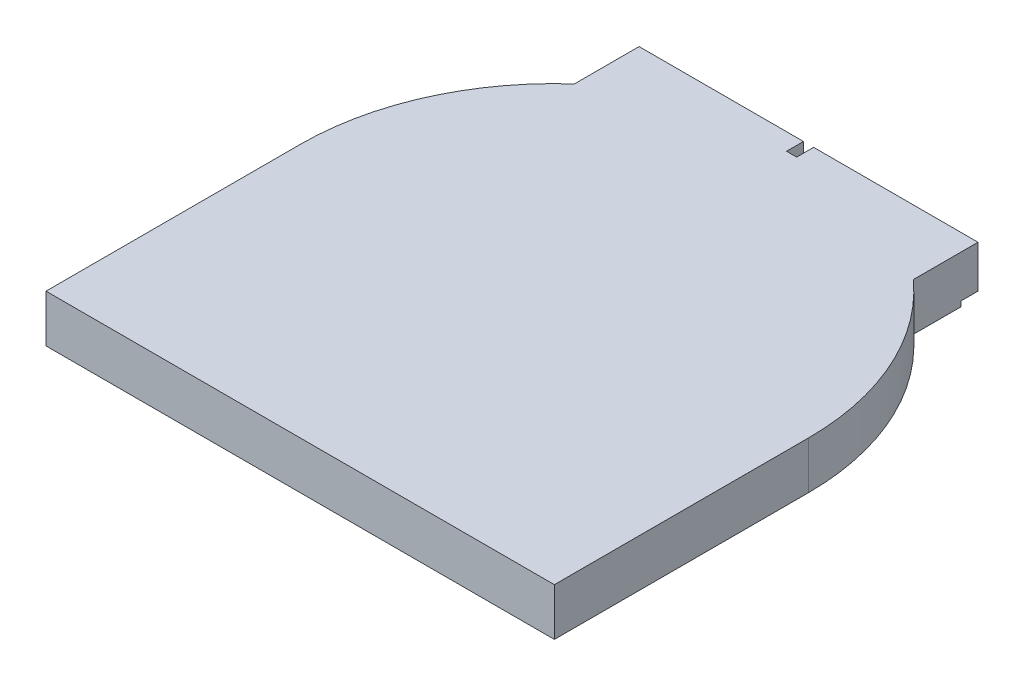
ISO-10303-21;
HEADER;
FILE_DESCRIPTION(('STEP AP214'),'2;1');
FILE_NAME('part.step','',(''),(''),'','','');
FILE_SCHEMA(('AUTOMOTIVE_DESIGN { 1 0 10303 214 1 1 1 1 }'));
ENDSEC;
DATA;
#1=APPLICATION_CONTEXT('core data for automotive mechanical design processes');
#2=APPLICATION_PROTOCOL_DEFINITION('international standard','automotive_design',2000,#1);
#3=PRODUCT_CONTEXT('',#1,'mechanical');
#4=PRODUCT('Part','Part','',(#3));
#5=PRODUCT_RELATED_PRODUCT_CATEGORY('part','',(#4));
#6=PRODUCT_DEFINITION_FORMATION('','',#4);
#7=PRODUCT_DEFINITION_CONTEXT('part definition',#1,'design');
#8=PRODUCT_DEFINITION('design','',#6,#7);
#9=PRODUCT_DEFINITION_SHAPE('','',#8);
#10=(LENGTH_UNIT() NAMED_UNIT(*) SI_UNIT(.MILLI.,.METRE.));
#11=(NAMED_UNIT(*) PLANE_ANGLE_UNIT() SI_UNIT($,.RADIAN.));
#12=(NAMED_UNIT(*) SI_UNIT($,.STERADIAN.) SOLID_ANGLE_UNIT());
#13=UNCERTAINTY_MEASURE_WITH_UNIT(LENGTH_MEASURE(1.E-05),#10,'distance_accuracy_value','');
#14=(GEOMETRIC_REPRESENTATION_CONTEXT(3) GLOBAL_UNCERTAINTY_ASSIGNED_CONTEXT((#13)) GLOBAL_UNIT_ASSIGNED_CONTEXT((#10,
#11,#12)) REPRESENTATION_CONTEXT('',''));
#15=CARTESIAN_POINT('',(0.,0.,0.));
#16=DIRECTION('',(0.,0.,1.));
#17=DIRECTION('',(1.,0.,0.));
#18=AXIS2_PLACEMENT_3D('',#15,#16,#17);
#19=CARTESIAN_POINT('',(-4.,0.8,-5.1234753829798));
#20=DIRECTION('',(0.,-1.,0.));
#21=DIRECTION('',(0.,0.,-1.));
#22=AXIS2_PLACEMENT_3D('',#19,#20,#21);
#23=CYLINDRICAL_SURFACE('',#22,1.);
#24=CARTESIAN_POINT('',(-4.,0.4,-5.1234753829798));
#25=DIRECTION('',(0.,-1.,0.));
#26=DIRECTION('',(0.,0.,-1.));
#27=AXIS2_PLACEMENT_3D('',#24,#25,#26);
#28=CIRCLE('',#27,1.);
#29=CARTESIAN_POINT('',(-3.,0.4,-5.1234753829798));
#30=VERTEX_POINT('',#29);
#31=CARTESIAN_POINT('',(-3.38461538461538,0.4,-4.33524840098291));
#32=VERTEX_POINT('',#31);
#33=EDGE_CURVE('E202',#30,#32,#28,.T.);
#34=ORIENTED_EDGE('',*,*,#33,.F.);
#35=DIRECTION('',(0.,-1.,0.));
#36=VECTOR('',#35,1.);
#37=CARTESIAN_POINT('',(-3.,0.8,-5.1234753829798));
#38=LINE('',#37,#36);
#39=CARTESIAN_POINT('',(-3.,0.8,-5.1234753829798));
#40=VERTEX_POINT('',#39);
#41=EDGE_CURVE('E200',#40,#30,#38,.T.);
#42=ORIENTED_EDGE('',*,*,#41,.F.);
#43=CARTESIAN_POINT('',(-4.,0.8,-5.1234753829798));
#44=DIRECTION('',(0.,1.,0.));
#45=DIRECTION('',(0.,0.,1.));
#46=AXIS2_PLACEMENT_3D('',#43,#44,#45);
#47=CIRCLE('',#46,1.);
#48=CARTESIAN_POINT('',(-3.38461538461538,0.8,-4.33524840098291));
#49=VERTEX_POINT('',#48);
#50=EDGE_CURVE('E262',#49,#40,#47,.T.);
#51=ORIENTED_EDGE('',*,*,#50,.F.);
#52=DIRECTION('',(0.,-1.,0.));
#53=VECTOR('',#52,1.);
#54=CARTESIAN_POINT('',(-3.38461538461538,0.8,-4.33524840098291));
#55=LINE('',#54,#53);
#56=EDGE_CURVE('E285',#49,#32,#55,.T.);
#57=ORIENTED_EDGE('',*,*,#56,.T.);
#58=EDGE_LOOP('',(#34,#42,#51,#57));
#59=FACE_BOUND('',#58,.T.);
#60=ADVANCED_FACE('F40',(#59),#23,.T.);
#61=CARTESIAN_POINT('',(-3.,0.8,-5.5));
#62=DIRECTION('',(-1.,0.,0.));
#63=DIRECTION('',(0.,0.,1.));
#64=AXIS2_PLACEMENT_3D('',#61,#62,#63);
#65=PLANE('',#64);
#66=DIRECTION('',(0.,0.,1.));
#67=VECTOR('',#66,1.);
#68=CARTESIAN_POINT('',(-3.,0.4,-5.5));
#69=LINE('',#68,#67);
#70=CARTESIAN_POINT('',(-3.,0.4,-7.));
#71=VERTEX_POINT('',#70);
#72=EDGE_CURVE('E188',#71,#30,#69,.T.);
#73=ORIENTED_EDGE('',*,*,#72,.F.);
#74=DIRECTION('',(0.,-1.,0.));
#75=VECTOR('',#74,1.);
#76=CARTESIAN_POINT('',(-3.,0.8,-7.));
#77=LINE('',#76,#75);
#78=CARTESIAN_POINT('',(-3.,0.55,-7.));
#79=VERTEX_POINT('',#78);
#80=EDGE_CURVE('E198',#79,#71,#77,.T.);
#81=ORIENTED_EDGE('',*,*,#80,.F.);
#82=DIRECTION('',(0.,0.,-1.));
#83=VECTOR('',#82,1.);
#84=CARTESIAN_POINT('',(-3.,0.55,-5.5));
#85=LINE('',#84,#83);
#86=CARTESIAN_POINT('',(-3.,0.55,-7.5));
#87=VERTEX_POINT('',#86);
#88=EDGE_CURVE('E224',#79,#87,#85,.T.);
#89=ORIENTED_EDGE('',*,*,#88,.T.);
#90=DIRECTION('',(0.,-1.,0.));
#91=VECTOR('',#90,1.);
#92=CARTESIAN_POINT('',(-3.,0.8,-7.5));
#93=LINE('',#92,#91);
#94=CARTESIAN_POINT('',(-3.,0.8,-7.5));
#95=VERTEX_POINT('',#94);
#96=EDGE_CURVE('E333',#95,#87,#93,.T.);
#97=ORIENTED_EDGE('',*,*,#96,.F.);
#98=DIRECTION('',(0.,0.,-1.));
#99=VECTOR('',#98,1.);
#100=CARTESIAN_POINT('',(-3.,0.8,-5.5));
#101=LINE('',#100,#99);
#102=EDGE_CURVE('E269',#40,#95,#101,.T.);
#103=ORIENTED_EDGE('',*,*,#102,.F.);
#104=ORIENTED_EDGE('',*,*,#41,.T.);
#105=EDGE_LOOP('',(#73,#81,#89,#97,#103,#104));
#106=FACE_BOUND('',#105,.T.);
#107=ADVANCED_FACE('F196',(#106),#65,.F.);
#108=CARTESIAN_POINT('',(-5.,0.8,-7.5));
#109=DIRECTION('',(1.,0.,0.));
#110=DIRECTION('',(0.,0.,-1.));
#111=AXIS2_PLACEMENT_3D('',#108,#109,#110);
#112=PLANE('',#111);
#113=DIRECTION('',(0.,0.,-1.));
#114=VECTOR('',#113,1.);
#115=CARTESIAN_POINT('',(-5.,0.4,-7.5));
#116=LINE('',#115,#114);
#117=CARTESIAN_POINT('',(-5.,0.4,-5.59016994374947));
#118=VERTEX_POINT('',#117);
#119=CARTESIAN_POINT('',(-5.,0.4,-7.));
#120=VERTEX_POINT('',#119);
#121=EDGE_CURVE('E55',#118,#120,#116,.T.);
#122=ORIENTED_EDGE('',*,*,#121,.F.);
#123=DIRECTION('',(0.,-1.,0.));
#124=VECTOR('',#123,1.);
#125=CARTESIAN_POINT('',(-5.,0.8,-5.59016994374947));
#126=LINE('',#125,#124);
#127=CARTESIAN_POINT('',(-5.,1.8,-5.59016994374947));
#128=VERTEX_POINT('',#127);
#129=EDGE_CURVE('E325',#128,#118,#126,.T.);
#130=ORIENTED_EDGE('',*,*,#129,.F.);
#131=DIRECTION('',(0.,0.,1.));
#132=VECTOR('',#131,1.);
#133=CARTESIAN_POINT('',(-5.,1.8,-7.5));
#134=LINE('',#133,#132);
#135=CARTESIAN_POINT('',(-5.,1.8,-7.5));
#136=VERTEX_POINT('',#135);
#137=EDGE_CURVE('E242',#136,#128,#134,.T.);
#138=ORIENTED_EDGE('',*,*,#137,.F.);
#139=DIRECTION('',(0.,-1.,0.));
#140=VECTOR('',#139,1.);
#141=CARTESIAN_POINT('',(-5.,0.8,-7.5));
#142=LINE('',#141,#140);
#143=CARTESIAN_POINT('',(-5.,0.55,-7.5));
#144=VERTEX_POINT('',#143);
#145=EDGE_CURVE('E329',#136,#144,#142,.T.);
#146=ORIENTED_EDGE('',*,*,#145,.T.);
#147=DIRECTION('',(0.,0.,-1.));
#148=VECTOR('',#147,1.);
#149=CARTESIAN_POINT('',(-5.,0.55,-7.));
#150=LINE('',#149,#148);
#151=CARTESIAN_POINT('',(-5.,0.55,-7.));
#152=VERTEX_POINT('',#151);
#153=EDGE_CURVE('E376',#152,#144,#150,.T.);
#154=ORIENTED_EDGE('',*,*,#153,.F.);
#155=DIRECTION('',(0.,1.,0.));
#156=VECTOR('',#155,1.);
#157=CARTESIAN_POINT('',(-5.,0.55,-7.));
#158=LINE('',#157,#156);
#159=EDGE_CURVE('E490',#120,#152,#158,.T.);
#160=ORIENTED_EDGE('',*,*,#159,.F.);
#161=EDGE_LOOP('',(#122,#130,#138,#146,#154,#160));
#162=FACE_BOUND('',#161,.T.);
#163=ADVANCED_FACE('F412',(#162),#112,.F.);
#164=CARTESIAN_POINT('',(0.,0.8,0.));
#165=DIRECTION('',(0.,-1.,0.));
#166=DIRECTION('',(0.,0.,-1.));
#167=AXIS2_PLACEMENT_3D('',#164,#165,#166);
#168=CYLINDRICAL_SURFACE('',#167,7.5);
#169=CARTESIAN_POINT('',(0.,0.4,0.));
#170=DIRECTION('',(0.,-1.,0.));
#171=DIRECTION('',(0.,0.,-1.));
#172=AXIS2_PLACEMENT_3D('',#169,#170,#171);
#173=CIRCLE('',#172,7.5);
#174=CARTESIAN_POINT('',(-7.5,0.4,0.));
#175=VERTEX_POINT('',#174);
#176=EDGE_CURVE('E416',#175,#118,#173,.T.);
#177=ORIENTED_EDGE('',*,*,#176,.F.);
#178=DIRECTION('',(0.,-1.,0.));
#179=VECTOR('',#178,1.);
#180=CARTESIAN_POINT('',(-7.5,0.8,0.));
#181=LINE('',#180,#179);
#182=CARTESIAN_POINT('',(-7.5,1.8,0.));
#183=VERTEX_POINT('',#182);
#184=EDGE_CURVE('E321',#183,#175,#181,.T.);
#185=ORIENTED_EDGE('',*,*,#184,.F.);
#186=CARTESIAN_POINT('',(0.,1.8,0.));
#187=DIRECTION('',(0.,1.,0.));
#188=DIRECTION('',(0.,0.,1.));
#189=AXIS2_PLACEMENT_3D('',#186,#187,#188);
#190=CIRCLE('',#189,7.5);
#191=EDGE_CURVE('E246',#128,#183,#190,.T.);
#192=ORIENTED_EDGE('',*,*,#191,.F.);
#193=ORIENTED_EDGE('',*,*,#129,.T.);
#194=EDGE_LOOP('',(#177,#185,#192,#193));
#195=FACE_BOUND('',#194,.T.);
#196=ADVANCED_FACE('F415',(#195),#168,.T.);
#197=CARTESIAN_POINT('',(-7.5,0.8,0.));
#198=DIRECTION('',(1.,0.,0.));
#199=DIRECTION('',(0.,0.,-1.));
#200=AXIS2_PLACEMENT_3D('',#197,#198,#199);
#201=PLANE('',#200);
#202=DIRECTION('',(0.,0.,-1.));
#203=VECTOR('',#202,1.);
#204=CARTESIAN_POINT('',(-7.5,0.4,0.));
#205=LINE('',#204,#203);
#206=CARTESIAN_POINT('',(-7.5,0.4,7.5));
#207=VERTEX_POINT('',#206);
#208=EDGE_CURVE('E364',#207,#175,#205,.T.);
#209=ORIENTED_EDGE('',*,*,#208,.F.);
#210=DIRECTION('',(0.,-1.,0.));
#211=VECTOR('',#210,1.);
#212=CARTESIAN_POINT('',(-7.5,0.8,7.5));
#213=LINE('',#212,#211);
#214=CARTESIAN_POINT('',(-7.5,1.8,7.5));
#215=VERTEX_POINT('',#214);
#216=EDGE_CURVE('E317',#215,#207,#213,.T.);
#217=ORIENTED_EDGE('',*,*,#216,.F.);
#218=DIRECTION('',(0.,0.,1.));
#219=VECTOR('',#218,1.);
#220=CARTESIAN_POINT('',(-7.5,1.8,0.));
#221=LINE('',#220,#219);
#222=EDGE_CURVE('E250',#183,#215,#221,.T.);
#223=ORIENTED_EDGE('',*,*,#222,.F.);
#224=ORIENTED_EDGE('',*,*,#184,.T.);
#225=EDGE_LOOP('',(#209,#217,#223,#224));
#226=FACE_BOUND('',#225,.T.);
#227=ADVANCED_FACE('F421',(#226),#201,.F.);
#228=CARTESIAN_POINT('',(-7.5,0.8,7.5));
#229=DIRECTION('',(0.,0.,-1.));
#230=DIRECTION('',(-1.,0.,0.));
#231=AXIS2_PLACEMENT_3D('',#228,#229,#230);
#232=PLANE('',#231);
#233=DIRECTION('',(-1.,0.,0.));
#234=VECTOR('',#233,1.);
#235=CARTESIAN_POINT('',(-7.5,0.4,7.5));
#236=LINE('',#235,#234);
#237=CARTESIAN_POINT('',(7.5,0.4,7.5));
#238=VERTEX_POINT('',#237);
#239=EDGE_CURVE('E425',#238,#207,#236,.T.);
#240=ORIENTED_EDGE('',*,*,#239,.F.);
#241=DIRECTION('',(0.,-1.,0.));
#242=VECTOR('',#241,1.);
#243=CARTESIAN_POINT('',(7.5,0.8,7.5));
#244=LINE('',#243,#242);
#245=CARTESIAN_POINT('',(7.5,1.8,7.5));
#246=VERTEX_POINT('',#245);
#247=EDGE_CURVE('E313',#246,#238,#244,.T.);
#248=ORIENTED_EDGE('',*,*,#247,.F.);
#249=DIRECTION('',(1.,0.,0.));
#250=VECTOR('',#249,1.);
#251=CARTESIAN_POINT('',(-7.5,1.8,7.5));
#252=LINE('',#251,#250);
#253=EDGE_CURVE('E254',#215,#246,#252,.T.);
#254=ORIENTED_EDGE('',*,*,#253,.F.);
#255=ORIENTED_EDGE('',*,*,#216,.T.);
#256=EDGE_LOOP('',(#240,#248,#254,#255));
#257=FACE_BOUND('',#256,.T.);
#258=ADVANCED_FACE('F424',(#257),#232,.F.);
#259=CARTESIAN_POINT('',(7.5,0.8,7.5));
#260=DIRECTION('',(-1.,0.,0.));
#261=DIRECTION('',(0.,0.,1.));
#262=AXIS2_PLACEMENT_3D('',#259,#260,#261);
#263=PLANE('',#262);
#264=DIRECTION('',(0.,0.,1.));
#265=VECTOR('',#264,1.);
#266=CARTESIAN_POINT('',(7.5,0.4,7.5));
#267=LINE('',#266,#265);
#268=CARTESIAN_POINT('',(7.5,0.4,0.));
#269=VERTEX_POINT('',#268);
#270=EDGE_CURVE('E431',#269,#238,#267,.T.);
#271=ORIENTED_EDGE('',*,*,#270,.F.);
#272=DIRECTION('',(0.,-1.,0.));
#273=VECTOR('',#272,1.);
#274=CARTESIAN_POINT('',(7.5,0.8,0.));
#275=LINE('',#274,#273);
#276=CARTESIAN_POINT('',(7.5,1.8,0.));
#277=VERTEX_POINT('',#276);
#278=EDGE_CURVE('E309',#277,#269,#275,.T.);
#279=ORIENTED_EDGE('',*,*,#278,.F.);
#280=DIRECTION('',(0.,0.,-1.));
#281=VECTOR('',#280,1.);
#282=CARTESIAN_POINT('',(7.5,1.8,7.5));
#283=LINE('',#282,#281);
#284=EDGE_CURVE('E258',#246,#277,#283,.T.);
#285=ORIENTED_EDGE('',*,*,#284,.F.);
#286=ORIENTED_EDGE('',*,*,#247,.T.);
#287=EDGE_LOOP('',(#271,#279,#285,#286));
#288=FACE_BOUND('',#287,.T.);
#289=ADVANCED_FACE('F430',(#288),#263,.F.);
#290=CARTESIAN_POINT('',(0.,0.8,0.));
#291=DIRECTION('',(0.,-1.,0.));
#292=DIRECTION('',(0.,0.,-1.));
#293=AXIS2_PLACEMENT_3D('',#290,#291,#292);
#294=CYLINDRICAL_SURFACE('',#293,7.5);
#295=CARTESIAN_POINT('',(0.,0.4,0.));
#296=DIRECTION('',(0.,-1.,0.));
#297=DIRECTION('',(0.,0.,-1.));
#298=AXIS2_PLACEMENT_3D('',#295,#296,#297);
#299=CIRCLE('',#298,7.5);
#300=CARTESIAN_POINT('',(5.,0.4,-5.59016994374947));
#301=VERTEX_POINT('',#300);
#302=EDGE_CURVE('E435',#301,#269,#299,.T.);
#303=ORIENTED_EDGE('',*,*,#302,.F.);
#304=DIRECTION('',(0.,-1.,0.));
#305=VECTOR('',#304,1.);
#306=CARTESIAN_POINT('',(5.,0.8,-5.59016994374947));
#307=LINE('',#306,#305);
#308=CARTESIAN_POINT('',(5.,1.8,-5.59016994374947));
#309=VERTEX_POINT('',#308);
#310=EDGE_CURVE('E305',#309,#301,#307,.T.);
#311=ORIENTED_EDGE('',*,*,#310,.F.);
#312=CARTESIAN_POINT('',(0.,1.8,0.));
#313=DIRECTION('',(0.,1.,0.));
#314=DIRECTION('',(0.,0.,1.));
#315=AXIS2_PLACEMENT_3D('',#312,#313,#314);
#316=CIRCLE('',#315,7.5);
#317=EDGE_CURVE('E228',#277,#309,#316,.T.);
#318=ORIENTED_EDGE('',*,*,#317,.F.);
#319=ORIENTED_EDGE('',*,*,#278,.T.);
#320=EDGE_LOOP('',(#303,#311,#318,#319));
#321=FACE_BOUND('',#320,.T.);
#322=ADVANCED_FACE('F434',(#321),#294,.T.);
#323=CARTESIAN_POINT('',(5.,0.8,-7.5));
#324=DIRECTION('',(-1.,0.,0.));
#325=DIRECTION('',(0.,0.,1.));
#326=AXIS2_PLACEMENT_3D('',#323,#324,#325);
#327=PLANE('',#326);
#328=DIRECTION('',(0.,0.,1.));
#329=VECTOR('',#328,1.);
#330=CARTESIAN_POINT('',(5.,0.4,-7.5));
#331=LINE('',#330,#329);
#332=CARTESIAN_POINT('',(5.,0.4,-7.));
#333=VERTEX_POINT('',#332);
#334=EDGE_CURVE('E471',#333,#301,#331,.T.);
#335=ORIENTED_EDGE('',*,*,#334,.F.);
#336=DIRECTION('',(0.,-1.,0.));
#337=VECTOR('',#336,1.);
#338=CARTESIAN_POINT('',(5.,0.55,-7.));
#339=LINE('',#338,#337);
#340=CARTESIAN_POINT('',(5.,0.55,-7.));
#341=VERTEX_POINT('',#340);
#342=EDGE_CURVE('E486',#341,#333,#339,.T.);
#343=ORIENTED_EDGE('',*,*,#342,.F.);
#344=DIRECTION('',(0.,0.,-1.));
#345=VECTOR('',#344,1.);
#346=CARTESIAN_POINT('',(5.,0.55,-7.));
#347=LINE('',#346,#345);
#348=CARTESIAN_POINT('',(5.,0.55,-7.5));
#349=VERTEX_POINT('',#348);
#350=EDGE_CURVE('E379',#341,#349,#347,.T.);
#351=ORIENTED_EDGE('',*,*,#350,.T.);
#352=DIRECTION('',(0.,-1.,0.));
#353=VECTOR('',#352,1.);
#354=CARTESIAN_POINT('',(5.,0.8,-7.5));
#355=LINE('',#354,#353);
#356=CARTESIAN_POINT('',(5.,1.8,-7.5));
#357=VERTEX_POINT('',#356);
#358=EDGE_CURVE('E301',#357,#349,#355,.T.);
#359=ORIENTED_EDGE('',*,*,#358,.F.);
#360=DIRECTION('',(0.,0.,-1.));
#361=VECTOR('',#360,1.);
#362=CARTESIAN_POINT('',(5.,1.8,-5.59016994374947));
#363=LINE('',#362,#361);
#364=EDGE_CURVE('E232',#309,#357,#363,.T.);
#365=ORIENTED_EDGE('',*,*,#364,.F.);
#366=ORIENTED_EDGE('',*,*,#310,.T.);
#367=EDGE_LOOP('',(#335,#343,#351,#359,#365,#366));
#368=FACE_BOUND('',#367,.T.);
#369=ADVANCED_FACE('F525',(#368),#327,.F.);
#370=CARTESIAN_POINT('',(3.,0.8,-5.5));
#371=DIRECTION('',(1.,0.,0.));
#372=DIRECTION('',(0.,0.,-1.));
#373=AXIS2_PLACEMENT_3D('',#370,#371,#372);
#374=PLANE('',#373);
#375=DIRECTION('',(0.,0.,-1.));
#376=VECTOR('',#375,1.);
#377=CARTESIAN_POINT('',(3.,0.4,-5.5));
#378=LINE('',#377,#376);
#379=CARTESIAN_POINT('',(3.,0.4,-5.1234753829798));
#380=VERTEX_POINT('',#379);
#381=CARTESIAN_POINT('',(3.,0.4,-7.));
#382=VERTEX_POINT('',#381);
#383=EDGE_CURVE('E443',#380,#382,#378,.T.);
#384=ORIENTED_EDGE('',*,*,#383,.F.);
#385=DIRECTION('',(0.,-1.,0.));
#386=VECTOR('',#385,1.);
#387=CARTESIAN_POINT('',(3.,0.8,-5.1234753829798));
#388=LINE('',#387,#386);
#389=CARTESIAN_POINT('',(3.,0.8,-5.1234753829798));
#390=VERTEX_POINT('',#389);
#391=EDGE_CURVE('E293',#390,#380,#388,.T.);
#392=ORIENTED_EDGE('',*,*,#391,.F.);
#393=DIRECTION('',(0.,0.,1.));
#394=VECTOR('',#393,1.);
#395=CARTESIAN_POINT('',(3.,0.8,-5.5));
#396=LINE('',#395,#394);
#397=CARTESIAN_POINT('',(3.,0.8,-7.5));
#398=VERTEX_POINT('',#397);
#399=EDGE_CURVE('E273',#398,#390,#396,.T.);
#400=ORIENTED_EDGE('',*,*,#399,.F.);
#401=DIRECTION('',(0.,-1.,0.));
#402=VECTOR('',#401,1.);
#403=CARTESIAN_POINT('',(3.,0.8,-7.5));
#404=LINE('',#403,#402);
#405=CARTESIAN_POINT('',(3.,0.55,-7.5));
#406=VERTEX_POINT('',#405);
#407=EDGE_CURVE('E297',#398,#406,#404,.T.);
#408=ORIENTED_EDGE('',*,*,#407,.T.);
#409=DIRECTION('',(0.,0.,1.));
#410=VECTOR('',#409,1.);
#411=CARTESIAN_POINT('',(3.,0.55,-5.5));
#412=LINE('',#411,#410);
#413=CARTESIAN_POINT('',(3.,0.55,-7.));
#414=VERTEX_POINT('',#413);
#415=EDGE_CURVE('E48',#406,#414,#412,.T.);
#416=ORIENTED_EDGE('',*,*,#415,.T.);
#417=DIRECTION('',(0.,1.,0.));
#418=VECTOR('',#417,1.);
#419=CARTESIAN_POINT('',(3.,0.8,-7.));
#420=LINE('',#419,#418);
#421=EDGE_CURVE('E210',#382,#414,#420,.T.);
#422=ORIENTED_EDGE('',*,*,#421,.F.);
#423=EDGE_LOOP('',(#384,#392,#400,#408,#416,#422));
#424=FACE_BOUND('',#423,.T.);
#425=ADVANCED_FACE('F343',(#424),#374,.F.);
#426=CARTESIAN_POINT('',(4.,0.8,-5.1234753829798));
#427=DIRECTION('',(0.,-1.,0.));
#428=DIRECTION('',(0.,0.,-1.));
#429=AXIS2_PLACEMENT_3D('',#426,#427,#428);
#430=CYLINDRICAL_SURFACE('',#429,1.);
#431=CARTESIAN_POINT('',(4.,0.4,-5.1234753829798));
#432=DIRECTION('',(0.,-1.,0.));
#433=DIRECTION('',(0.,0.,-1.));
#434=AXIS2_PLACEMENT_3D('',#431,#432,#433);
#435=CIRCLE('',#434,1.);
#436=CARTESIAN_POINT('',(3.38461538461539,0.4,-4.33524840098291));
#437=VERTEX_POINT('',#436);
#438=EDGE_CURVE('E448',#437,#380,#435,.T.);
#439=ORIENTED_EDGE('',*,*,#438,.F.);
#440=DIRECTION('',(0.,-1.,0.));
#441=VECTOR('',#440,1.);
#442=CARTESIAN_POINT('',(3.38461538461539,0.8,-4.33524840098291));
#443=LINE('',#442,#441);
#444=CARTESIAN_POINT('',(3.38461538461539,0.8,-4.33524840098291));
#445=VERTEX_POINT('',#444);
#446=EDGE_CURVE('E289',#445,#437,#443,.T.);
#447=ORIENTED_EDGE('',*,*,#446,.F.);
#448=CARTESIAN_POINT('',(4.,0.8,-5.1234753829798));
#449=DIRECTION('',(0.,1.,0.));
#450=DIRECTION('',(0.,0.,-1.));
#451=AXIS2_PLACEMENT_3D('',#448,#449,#450);
#452=CIRCLE('',#451,1.);
#453=EDGE_CURVE('E277',#390,#445,#452,.T.);
#454=ORIENTED_EDGE('',*,*,#453,.F.);
#455=ORIENTED_EDGE('',*,*,#391,.T.);
#456=EDGE_LOOP('',(#439,#447,#454,#455));
#457=FACE_BOUND('',#456,.T.);
#458=ADVANCED_FACE('F446',(#457),#430,.T.);
#459=CARTESIAN_POINT('',(0.,0.8,0.));
#460=DIRECTION('',(0.,-1.,0.));
#461=DIRECTION('',(0.,0.,-1.));
#462=AXIS2_PLACEMENT_3D('',#459,#460,#461);
#463=CYLINDRICAL_SURFACE('',#462,5.5);
#464=CARTESIAN_POINT('',(0.,0.4,0.));
#465=DIRECTION('',(0.,-1.,0.));
#466=DIRECTION('',(0.,0.,-1.));
#467=AXIS2_PLACEMENT_3D('',#464,#465,#466);
#468=CIRCLE('',#467,5.5);
#469=EDGE_CURVE('E455',#32,#437,#468,.F.);
#470=ORIENTED_EDGE('',*,*,#469,.F.);
#471=ORIENTED_EDGE('',*,*,#56,.F.);
#472=CARTESIAN_POINT('',(0.,0.8,0.));
#473=DIRECTION('',(0.,-1.,0.));
#474=DIRECTION('',(0.,0.,1.));
#475=AXIS2_PLACEMENT_3D('',#472,#473,#474);
#476=CIRCLE('',#475,5.5);
#477=EDGE_CURVE('E281',#445,#49,#476,.T.);
#478=ORIENTED_EDGE('',*,*,#477,.F.);
#479=ORIENTED_EDGE('',*,*,#446,.T.);
#480=EDGE_LOOP('',(#470,#471,#478,#479));
#481=FACE_BOUND('',#480,.T.);
#482=ADVANCED_FACE('F452',(#481),#463,.F.);
#483=CARTESIAN_POINT('',(0.,0.,-7.));
#484=DIRECTION('',(0.,0.,-1.));
#485=DIRECTION('',(-1.,0.,0.));
#486=AXIS2_PLACEMENT_3D('',#483,#484,#485);
#487=PLANE('',#486);
#488=ORIENTED_EDGE('',*,*,#342,.T.);
#489=DIRECTION('',(-1.,0.,0.));
#490=VECTOR('',#489,1.);
#491=CARTESIAN_POINT('',(0.,0.4,-7.));
#492=LINE('',#491,#490);
#493=EDGE_CURVE('E467',#333,#382,#492,.T.);
#494=ORIENTED_EDGE('',*,*,#493,.T.);
#495=ORIENTED_EDGE('',*,*,#421,.T.);
#496=DIRECTION('',(1.,0.,0.));
#497=VECTOR('',#496,1.);
#498=CARTESIAN_POINT('',(5.,0.55,-7.));
#499=LINE('',#498,#497);
#500=EDGE_CURVE('E352',#414,#341,#499,.T.);
#501=ORIENTED_EDGE('',*,*,#500,.T.);
#502=EDGE_LOOP('',(#488,#494,#495,#501));
#503=FACE_BOUND('',#502,.T.);
#504=ADVANCED_FACE('F536',(#503),#487,.T.);
#505=ORIENTED_EDGE('',*,*,#80,.T.);
#506=DIRECTION('',(-1.,0.,0.));
#507=VECTOR('',#506,1.);
#508=CARTESIAN_POINT('',(0.,0.4,-7.));
#509=LINE('',#508,#507);
#510=EDGE_CURVE('E11',#71,#120,#509,.T.);
#511=ORIENTED_EDGE('',*,*,#510,.T.);
#512=ORIENTED_EDGE('',*,*,#159,.T.);
#513=DIRECTION('',(1.,0.,0.));
#514=VECTOR('',#513,1.);
#515=CARTESIAN_POINT('',(-0.15,0.55,-7.));
#516=LINE('',#515,#514);
#517=EDGE_CURVE('E207',#152,#79,#516,.T.);
#518=ORIENTED_EDGE('',*,*,#517,.T.);
#519=EDGE_LOOP('',(#505,#511,#512,#518));
#520=FACE_BOUND('',#519,.T.);
#521=ADVANCED_FACE('F205',(#520),#487,.T.);
#522=CARTESIAN_POINT('',(3.,0.8,-7.5));
#523=DIRECTION('',(0.,0.,1.));
#524=DIRECTION('',(1.,0.,0.));
#525=AXIS2_PLACEMENT_3D('',#522,#523,#524);
#526=PLANE('',#525);
#527=DIRECTION('',(-1.,0.,0.));
#528=VECTOR('',#527,1.);
#529=CARTESIAN_POINT('',(-3.,0.8,-7.5));
#530=LINE('',#529,#528);
#531=CARTESIAN_POINT('',(0.15,0.8,-7.5));
#532=VERTEX_POINT('',#531);
#533=EDGE_CURVE('E233',#398,#532,#530,.T.);
#534=ORIENTED_EDGE('',*,*,#533,.T.);
#535=DIRECTION('',(0.,-1.,0.));
#536=VECTOR('',#535,1.);
#537=CARTESIAN_POINT('',(0.15,1.8,-7.5));
#538=LINE('',#537,#536);
#539=CARTESIAN_POINT('',(0.15,1.8,-7.5));
#540=VERTEX_POINT('',#539);
#541=EDGE_CURVE('E358',#540,#532,#538,.T.);
#542=ORIENTED_EDGE('',*,*,#541,.F.);
#543=DIRECTION('',(-1.,0.,0.));
#544=VECTOR('',#543,1.);
#545=CARTESIAN_POINT('',(5.,1.8,-7.5));
#546=LINE('',#545,#544);
#547=EDGE_CURVE('E238',#357,#540,#546,.T.);
#548=ORIENTED_EDGE('',*,*,#547,.F.);
#549=ORIENTED_EDGE('',*,*,#358,.T.);
#550=DIRECTION('',(1.,0.,0.));
#551=VECTOR('',#550,1.);
#552=CARTESIAN_POINT('',(5.,0.55,-7.5));
#553=LINE('',#552,#551);
#554=EDGE_CURVE('E350',#406,#349,#553,.T.);
#555=ORIENTED_EDGE('',*,*,#554,.F.);
#556=ORIENTED_EDGE('',*,*,#407,.F.);
#557=EDGE_LOOP('',(#534,#542,#548,#549,#555,#556));
#558=FACE_BOUND('',#557,.T.);
#559=ADVANCED_FACE('F354',(#558),#526,.F.);
#560=CARTESIAN_POINT('',(-0.15,1.8,-7.5));
#561=VERTEX_POINT('',#560);
#562=EDGE_CURVE('E237',#561,#136,#546,.T.);
#563=ORIENTED_EDGE('',*,*,#562,.F.);
#564=DIRECTION('',(0.,1.,0.));
#565=VECTOR('',#564,1.);
#566=CARTESIAN_POINT('',(-0.15,1.8,-7.5));
#567=LINE('',#566,#565);
#568=CARTESIAN_POINT('',(-0.15,0.8,-7.5));
#569=VERTEX_POINT('',#568);
#570=EDGE_CURVE('E362',#569,#561,#567,.T.);
#571=ORIENTED_EDGE('',*,*,#570,.F.);
#572=EDGE_CURVE('E227',#569,#95,#530,.T.);
#573=ORIENTED_EDGE('',*,*,#572,.T.);
#574=ORIENTED_EDGE('',*,*,#96,.T.);
#575=DIRECTION('',(1.,0.,0.));
#576=VECTOR('',#575,1.);
#577=CARTESIAN_POINT('',(-0.15,0.55,-7.5));
#578=LINE('',#577,#576);
#579=EDGE_CURVE('E357',#144,#87,#578,.T.);
#580=ORIENTED_EDGE('',*,*,#579,.F.);
#581=ORIENTED_EDGE('',*,*,#145,.F.);
#582=EDGE_LOOP('',(#563,#571,#573,#574,#580,#581));
#583=FACE_BOUND('',#582,.T.);
#584=ADVANCED_FACE('F409',(#583),#526,.F.);
#585=CARTESIAN_POINT('',(0.,0.8,0.));
#586=DIRECTION('',(0.,1.,0.));
#587=DIRECTION('',(0.,0.,1.));
#588=AXIS2_PLACEMENT_3D('',#585,#586,#587);
#589=PLANE('',#588);
#590=DIRECTION('',(-1.,0.,0.));
#591=VECTOR('',#590,1.);
#592=CARTESIAN_POINT('',(0.,0.8,-7.));
#593=LINE('',#592,#591);
#594=CARTESIAN_POINT('',(0.15,0.8,-7.));
#595=VERTEX_POINT('',#594);
#596=CARTESIAN_POINT('',(-0.15,0.8,-7.));
#597=VERTEX_POINT('',#596);
#598=EDGE_CURVE('E217',#595,#597,#593,.T.);
#599=ORIENTED_EDGE('',*,*,#598,.F.);
#600=DIRECTION('',(0.,0.,-1.));
#601=VECTOR('',#600,1.);
#602=CARTESIAN_POINT('',(0.15,0.8,0.));
#603=LINE('',#602,#601);
#604=EDGE_CURVE('E215',#595,#532,#603,.T.);
#605=ORIENTED_EDGE('',*,*,#604,.T.);
#606=ORIENTED_EDGE('',*,*,#533,.F.);
#607=ORIENTED_EDGE('',*,*,#399,.T.);
#608=ORIENTED_EDGE('',*,*,#453,.T.);
#609=ORIENTED_EDGE('',*,*,#477,.T.);
#610=ORIENTED_EDGE('',*,*,#50,.T.);
#611=ORIENTED_EDGE('',*,*,#102,.T.);
#612=ORIENTED_EDGE('',*,*,#572,.F.);
#613=DIRECTION('',(0.,0.,1.));
#614=VECTOR('',#613,1.);
#615=CARTESIAN_POINT('',(-0.15,0.8,0.));
#616=LINE('',#615,#614);
#617=EDGE_CURVE('E209',#569,#597,#616,.T.);
#618=ORIENTED_EDGE('',*,*,#617,.T.);
#619=EDGE_LOOP('',(#599,#605,#606,#607,#608,#609,#610,#611,#612,#618));
#620=FACE_BOUND('',#619,.T.);
#621=ADVANCED_FACE('F396',(#620),#589,.F.);
#622=CARTESIAN_POINT('',(0.,1.8,0.));
#623=DIRECTION('',(0.,1.,0.));
#624=DIRECTION('',(0.,0.,1.));
#625=AXIS2_PLACEMENT_3D('',#622,#623,#624);
#626=PLANE('',#625);
#627=DIRECTION('',(0.,0.,-1.));
#628=VECTOR('',#627,1.);
#629=CARTESIAN_POINT('',(0.15,1.8,-7.));
#630=LINE('',#629,#628);
#631=CARTESIAN_POINT('',(0.15,1.8,-7.));
#632=VERTEX_POINT('',#631);
#633=EDGE_CURVE('E371',#632,#540,#630,.T.);
#634=ORIENTED_EDGE('',*,*,#633,.F.);
#635=DIRECTION('',(1.,0.,0.));
#636=VECTOR('',#635,1.);
#637=CARTESIAN_POINT('',(0.15,1.8,-7.));
#638=LINE('',#637,#636);
#639=CARTESIAN_POINT('',(-0.15,1.8,-7.));
#640=VERTEX_POINT('',#639);
#641=EDGE_CURVE('E381',#640,#632,#638,.T.);
#642=ORIENTED_EDGE('',*,*,#641,.F.);
#643=DIRECTION('',(0.,0.,-1.));
#644=VECTOR('',#643,1.);
#645=CARTESIAN_POINT('',(-0.15,1.8,-7.));
#646=LINE('',#645,#644);
#647=EDGE_CURVE('E62',#640,#561,#646,.T.);
#648=ORIENTED_EDGE('',*,*,#647,.T.);
#649=ORIENTED_EDGE('',*,*,#562,.T.);
#650=ORIENTED_EDGE('',*,*,#137,.T.);
#651=ORIENTED_EDGE('',*,*,#191,.T.);
#652=ORIENTED_EDGE('',*,*,#222,.T.);
#653=ORIENTED_EDGE('',*,*,#253,.T.);
#654=ORIENTED_EDGE('',*,*,#284,.T.);
#655=ORIENTED_EDGE('',*,*,#317,.T.);
#656=ORIENTED_EDGE('',*,*,#364,.T.);
#657=ORIENTED_EDGE('',*,*,#547,.T.);
#658=EDGE_LOOP('',(#634,#642,#648,#649,#650,#651,#652,#653,#654,#655,#656,#657));
#659=FACE_BOUND('',#658,.T.);
#660=ADVANCED_FACE('F405',(#659),#626,.T.);
#661=ORIENTED_EDGE('',*,*,#598,.T.);
#662=DIRECTION('',(0.,1.,0.));
#663=VECTOR('',#662,1.);
#664=CARTESIAN_POINT('',(-0.15,1.8,-7.));
#665=LINE('',#664,#663);
#666=EDGE_CURVE('E388',#597,#640,#665,.T.);
#667=ORIENTED_EDGE('',*,*,#666,.T.);
#668=ORIENTED_EDGE('',*,*,#641,.T.);
#669=DIRECTION('',(0.,-1.,0.));
#670=VECTOR('',#669,1.);
#671=CARTESIAN_POINT('',(0.15,1.8,-7.));
#672=LINE('',#671,#670);
#673=EDGE_CURVE('E370',#632,#595,#672,.T.);
#674=ORIENTED_EDGE('',*,*,#673,.T.);
#675=EDGE_LOOP('',(#661,#667,#668,#674));
#676=FACE_BOUND('',#675,.T.);
#677=ADVANCED_FACE('F386',(#676),#487,.T.);
#678=CARTESIAN_POINT('',(-0.15,1.8,-7.));
#679=DIRECTION('',(-1.,0.,0.));
#680=DIRECTION('',(0.,-1.,0.));
#681=AXIS2_PLACEMENT_3D('',#678,#679,#680);
#682=PLANE('',#681);
#683=ORIENTED_EDGE('',*,*,#570,.T.);
#684=ORIENTED_EDGE('',*,*,#647,.F.);
#685=ORIENTED_EDGE('',*,*,#666,.F.);
#686=ORIENTED_EDGE('',*,*,#617,.F.);
#687=EDGE_LOOP('',(#683,#684,#685,#686));
#688=FACE_BOUND('',#687,.T.);
#689=ADVANCED_FACE('F391',(#688),#682,.F.);
#690=CARTESIAN_POINT('',(0.15,1.8,-7.));
#691=DIRECTION('',(1.,0.,0.));
#692=DIRECTION('',(0.,1.,0.));
#693=AXIS2_PLACEMENT_3D('',#690,#691,#692);
#694=PLANE('',#693);
#695=ORIENTED_EDGE('',*,*,#673,.F.);
#696=ORIENTED_EDGE('',*,*,#633,.T.);
#697=ORIENTED_EDGE('',*,*,#541,.T.);
#698=ORIENTED_EDGE('',*,*,#604,.F.);
#699=EDGE_LOOP('',(#695,#696,#697,#698));
#700=FACE_BOUND('',#699,.T.);
#701=ADVANCED_FACE('F441',(#700),#694,.F.);
#702=CARTESIAN_POINT('',(5.,0.55,-7.));
#703=DIRECTION('',(0.,1.,0.));
#704=DIRECTION('',(-1.,0.,0.));
#705=AXIS2_PLACEMENT_3D('',#702,#703,#704);
#706=PLANE('',#705);
#707=ORIENTED_EDGE('',*,*,#554,.T.);
#708=ORIENTED_EDGE('',*,*,#350,.F.);
#709=ORIENTED_EDGE('',*,*,#500,.F.);
#710=ORIENTED_EDGE('',*,*,#415,.F.);
#711=EDGE_LOOP('',(#707,#708,#709,#710));
#712=FACE_BOUND('',#711,.T.);
#713=ADVANCED_FACE('F348',(#712),#706,.F.);
#714=CARTESIAN_POINT('',(-0.15,0.55,-7.));
#715=DIRECTION('',(0.,1.,0.));
#716=DIRECTION('',(-1.,0.,0.));
#717=AXIS2_PLACEMENT_3D('',#714,#715,#716);
#718=PLANE('',#717);
#719=ORIENTED_EDGE('',*,*,#517,.F.);
#720=ORIENTED_EDGE('',*,*,#153,.T.);
#721=ORIENTED_EDGE('',*,*,#579,.T.);
#722=ORIENTED_EDGE('',*,*,#88,.F.);
#723=EDGE_LOOP('',(#719,#720,#721,#722));
#724=FACE_BOUND('',#723,.T.);
#725=ADVANCED_FACE('F496',(#724),#718,.F.);
#726=CARTESIAN_POINT('',(0.,0.4,0.));
#727=DIRECTION('',(0.,-1.,0.));
#728=DIRECTION('',(0.,0.,-1.));
#729=AXIS2_PLACEMENT_3D('',#726,#727,#728);
#730=PLANE('',#729);
#731=ORIENTED_EDGE('',*,*,#208,.T.);
#732=ORIENTED_EDGE('',*,*,#176,.T.);
#733=ORIENTED_EDGE('',*,*,#121,.T.);
#734=ORIENTED_EDGE('',*,*,#510,.F.);
#735=ORIENTED_EDGE('',*,*,#72,.T.);
#736=ORIENTED_EDGE('',*,*,#33,.T.);
#737=ORIENTED_EDGE('',*,*,#469,.T.);
#738=ORIENTED_EDGE('',*,*,#438,.T.);
#739=ORIENTED_EDGE('',*,*,#383,.T.);
#740=ORIENTED_EDGE('',*,*,#493,.F.);
#741=ORIENTED_EDGE('',*,*,#334,.T.);
#742=ORIENTED_EDGE('',*,*,#302,.T.);
#743=ORIENTED_EDGE('',*,*,#270,.T.);
#744=ORIENTED_EDGE('',*,*,#239,.T.);
#745=EDGE_LOOP('',(#731,#732,#733,#734,#735,#736,#737,#738,#739,#740,#741,#742,#743,#744));
#746=FACE_BOUND('',#745,.T.);
#747=ADVANCED_FACE('F187',(#746),#730,.T.);
#748=CLOSED_SHELL('',(#60,#107,#163,#196,#227,#258,#289,#322,#369,#425,#458,#482,#504,#521,#559,
#584,#621,#660,#677,#689,#701,#713,#725,#747));
#749=MANIFOLD_SOLID_BREP('B2',#748);
#750=ADVANCED_BREP_SHAPE_REPRESENTATION('',(#18,#749),#14);
#751=SHAPE_DEFINITION_REPRESENTATION(#9,#750);
ENDSEC;
END-ISO-10303-21;
